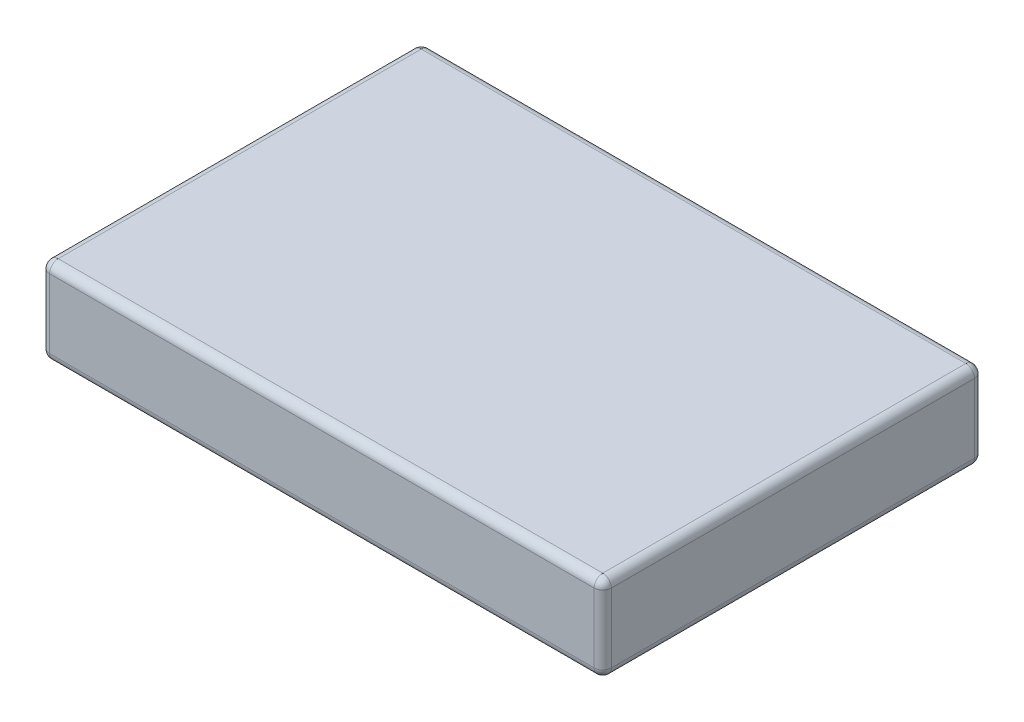
ISO-10303-21;
HEADER;
FILE_DESCRIPTION(('STEP AP214'),'2;1');
FILE_NAME('part.step','',(''),(''),'','','');
FILE_SCHEMA(('AUTOMOTIVE_DESIGN { 1 0 10303 214 1 1 1 1 }'));
ENDSEC;
DATA;
#1=APPLICATION_CONTEXT('core data for automotive mechanical design processes');
#2=APPLICATION_PROTOCOL_DEFINITION('international standard','automotive_design',2000,#1);
#3=PRODUCT_CONTEXT('',#1,'mechanical');
#4=PRODUCT('Part','Part','',(#3));
#5=PRODUCT_RELATED_PRODUCT_CATEGORY('part','',(#4));
#6=PRODUCT_DEFINITION_FORMATION('','',#4);
#7=PRODUCT_DEFINITION_CONTEXT('part definition',#1,'design');
#8=PRODUCT_DEFINITION('design','',#6,#7);
#9=PRODUCT_DEFINITION_SHAPE('','',#8);
#10=(LENGTH_UNIT() NAMED_UNIT(*) SI_UNIT(.MILLI.,.METRE.));
#11=(NAMED_UNIT(*) PLANE_ANGLE_UNIT() SI_UNIT($,.RADIAN.));
#12=(NAMED_UNIT(*) SI_UNIT($,.STERADIAN.) SOLID_ANGLE_UNIT());
#13=UNCERTAINTY_MEASURE_WITH_UNIT(LENGTH_MEASURE(1.E-05),#10,'distance_accuracy_value','');
#14=(GEOMETRIC_REPRESENTATION_CONTEXT(3) GLOBAL_UNCERTAINTY_ASSIGNED_CONTEXT((#13)) GLOBAL_UNIT_ASSIGNED_CONTEXT((#10,
#11,#12)) REPRESENTATION_CONTEXT('',''));
#15=CARTESIAN_POINT('',(0.,0.,0.));
#16=DIRECTION('',(0.,0.,1.));
#17=DIRECTION('',(1.,0.,0.));
#18=AXIS2_PLACEMENT_3D('',#15,#16,#17);
#19=CARTESIAN_POINT('',(3.97905,3.1756,1.202025));
#20=DIRECTION('',(1.,0.,0.));
#21=DIRECTION('',(0.,0.,-1.));
#22=AXIS2_PLACEMENT_3D('',#19,#20,#21);
#23=PLANE('',#22);
#24=DIRECTION('',(0.,0.,-1.));
#25=VECTOR('',#24,1.);
#26=CARTESIAN_POINT('',(3.97905,3.1556,1.202025));
#27=LINE('',#26,#25);
#28=CARTESIAN_POINT('',(3.97905,3.1556,1.182025));
#29=VERTEX_POINT('',#28);
#30=CARTESIAN_POINT('',(3.97905,3.1556,0.342024999999994));
#31=VERTEX_POINT('',#30);
#32=EDGE_CURVE('E11',#29,#31,#27,.T.);
#33=ORIENTED_EDGE('',*,*,#32,.T.);
#34=DIRECTION('',(0.,-1.,0.));
#35=VECTOR('',#34,1.);
#36=CARTESIAN_POINT('',(3.97905,3.1756,0.342024999999994));
#37=LINE('',#36,#35);
#38=CARTESIAN_POINT('',(3.97905,2.9956,0.342024999999994));
#39=VERTEX_POINT('',#38);
#40=EDGE_CURVE('E24',#31,#39,#37,.T.);
#41=ORIENTED_EDGE('',*,*,#40,.T.);
#42=DIRECTION('',(0.,0.,1.));
#43=VECTOR('',#42,1.);
#44=CARTESIAN_POINT('',(3.97905,2.9956,1.202025));
#45=LINE('',#44,#43);
#46=CARTESIAN_POINT('',(3.97905,2.9956,1.182025));
#47=VERTEX_POINT('',#46);
#48=EDGE_CURVE('E211',#39,#47,#45,.T.);
#49=ORIENTED_EDGE('',*,*,#48,.T.);
#50=DIRECTION('',(0.,1.,0.));
#51=VECTOR('',#50,1.);
#52=CARTESIAN_POINT('',(3.97905,3.1756,1.182025));
#53=LINE('',#52,#51);
#54=EDGE_CURVE('E209',#47,#29,#53,.T.);
#55=ORIENTED_EDGE('',*,*,#54,.T.);
#56=EDGE_LOOP('',(#33,#41,#49,#55));
#57=FACE_BOUND('',#56,.T.);
#58=ADVANCED_FACE('F17',(#57),#23,.F.);
#59=CARTESIAN_POINT('',(3.97905,3.1756,1.202025));
#60=DIRECTION('',(0.,0.,-1.));
#61=DIRECTION('',(-1.,0.,0.));
#62=AXIS2_PLACEMENT_3D('',#59,#60,#61);
#63=PLANE('',#62);
#64=DIRECTION('',(-1.,0.,0.));
#65=VECTOR('',#64,1.);
#66=CARTESIAN_POINT('',(3.97905,3.1556,1.202025));
#67=LINE('',#66,#65);
#68=CARTESIAN_POINT('',(5.25905,3.1556,1.202025));
#69=VERTEX_POINT('',#68);
#70=CARTESIAN_POINT('',(3.99905,3.1556,1.202025));
#71=VERTEX_POINT('',#70);
#72=EDGE_CURVE('E207',#69,#71,#67,.T.);
#73=ORIENTED_EDGE('',*,*,#72,.T.);
#74=DIRECTION('',(0.,-1.,0.));
#75=VECTOR('',#74,1.);
#76=CARTESIAN_POINT('',(3.99905,3.1756,1.202025));
#77=LINE('',#76,#75);
#78=CARTESIAN_POINT('',(3.99905,2.9956,1.202025));
#79=VERTEX_POINT('',#78);
#80=EDGE_CURVE('E205',#71,#79,#77,.T.);
#81=ORIENTED_EDGE('',*,*,#80,.T.);
#82=DIRECTION('',(1.,0.,0.));
#83=VECTOR('',#82,1.);
#84=CARTESIAN_POINT('',(5.27905,2.9956,1.202025));
#85=LINE('',#84,#83);
#86=CARTESIAN_POINT('',(5.25905,2.9956,1.202025));
#87=VERTEX_POINT('',#86);
#88=EDGE_CURVE('E203',#79,#87,#85,.T.);
#89=ORIENTED_EDGE('',*,*,#88,.T.);
#90=DIRECTION('',(0.,1.,0.));
#91=VECTOR('',#90,1.);
#92=CARTESIAN_POINT('',(5.25905,3.1756,1.202025));
#93=LINE('',#92,#91);
#94=EDGE_CURVE('E200',#87,#69,#93,.T.);
#95=ORIENTED_EDGE('',*,*,#94,.T.);
#96=EDGE_LOOP('',(#73,#81,#89,#95));
#97=FACE_BOUND('',#96,.T.);
#98=ADVANCED_FACE('F258',(#97),#63,.F.);
#99=CARTESIAN_POINT('',(5.27905,3.1756,1.202025));
#100=DIRECTION('',(-1.,0.,0.));
#101=DIRECTION('',(0.,0.,1.));
#102=AXIS2_PLACEMENT_3D('',#99,#100,#101);
#103=PLANE('',#102);
#104=DIRECTION('',(0.,1.,0.));
#105=VECTOR('',#104,1.);
#106=CARTESIAN_POINT('',(5.27905,3.1756,0.342024999999994));
#107=LINE('',#106,#105);
#108=CARTESIAN_POINT('',(5.27905,2.9956,0.342024999999995));
#109=VERTEX_POINT('',#108);
#110=CARTESIAN_POINT('',(5.27905,3.1556,0.342024999999995));
#111=VERTEX_POINT('',#110);
#112=EDGE_CURVE('E198',#109,#111,#107,.T.);
#113=ORIENTED_EDGE('',*,*,#112,.T.);
#114=DIRECTION('',(0.,0.,1.));
#115=VECTOR('',#114,1.);
#116=CARTESIAN_POINT('',(5.27905,3.1556,1.202025));
#117=LINE('',#116,#115);
#118=CARTESIAN_POINT('',(5.27905,3.1556,1.182025));
#119=VERTEX_POINT('',#118);
#120=EDGE_CURVE('E196',#111,#119,#117,.T.);
#121=ORIENTED_EDGE('',*,*,#120,.T.);
#122=DIRECTION('',(0.,-1.,0.));
#123=VECTOR('',#122,1.);
#124=CARTESIAN_POINT('',(5.27905,3.1756,1.182025));
#125=LINE('',#124,#123);
#126=CARTESIAN_POINT('',(5.27905,2.9956,1.182025));
#127=VERTEX_POINT('',#126);
#128=EDGE_CURVE('E194',#119,#127,#125,.T.);
#129=ORIENTED_EDGE('',*,*,#128,.T.);
#130=DIRECTION('',(0.,0.,-1.));
#131=VECTOR('',#130,1.);
#132=CARTESIAN_POINT('',(5.27905,2.9956,0.322024999999995));
#133=LINE('',#132,#131);
#134=EDGE_CURVE('E138',#127,#109,#133,.T.);
#135=ORIENTED_EDGE('',*,*,#134,.T.);
#136=EDGE_LOOP('',(#113,#121,#129,#135));
#137=FACE_BOUND('',#136,.T.);
#138=ADVANCED_FACE('F278',(#137),#103,.F.);
#139=CARTESIAN_POINT('',(3.97905,3.1756,0.322024999999995));
#140=DIRECTION('',(0.,0.,1.));
#141=DIRECTION('',(1.,0.,0.));
#142=AXIS2_PLACEMENT_3D('',#139,#140,#141);
#143=PLANE('',#142);
#144=DIRECTION('',(1.,0.,0.));
#145=VECTOR('',#144,1.);
#146=CARTESIAN_POINT('',(3.97905,3.1556,0.322024999999995));
#147=LINE('',#146,#145);
#148=CARTESIAN_POINT('',(3.99905,3.1556,0.322024999999995));
#149=VERTEX_POINT('',#148);
#150=CARTESIAN_POINT('',(5.25905,3.1556,0.322024999999995));
#151=VERTEX_POINT('',#150);
#152=EDGE_CURVE('E191',#149,#151,#147,.T.);
#153=ORIENTED_EDGE('',*,*,#152,.T.);
#154=DIRECTION('',(0.,-1.,0.));
#155=VECTOR('',#154,1.);
#156=CARTESIAN_POINT('',(5.25905,3.1756,0.322024999999995));
#157=LINE('',#156,#155);
#158=CARTESIAN_POINT('',(5.25905,2.9956,0.322024999999995));
#159=VERTEX_POINT('',#158);
#160=EDGE_CURVE('E189',#151,#159,#157,.T.);
#161=ORIENTED_EDGE('',*,*,#160,.T.);
#162=DIRECTION('',(-1.,0.,0.));
#163=VECTOR('',#162,1.);
#164=CARTESIAN_POINT('',(3.97905,2.9956,0.322024999999995));
#165=LINE('',#164,#163);
#166=CARTESIAN_POINT('',(3.99905,2.9956,0.322024999999995));
#167=VERTEX_POINT('',#166);
#168=EDGE_CURVE('E187',#159,#167,#165,.T.);
#169=ORIENTED_EDGE('',*,*,#168,.T.);
#170=DIRECTION('',(0.,1.,0.));
#171=VECTOR('',#170,1.);
#172=CARTESIAN_POINT('',(3.99905,3.1756,0.322024999999995));
#173=LINE('',#172,#171);
#174=EDGE_CURVE('E184',#167,#149,#173,.T.);
#175=ORIENTED_EDGE('',*,*,#174,.T.);
#176=EDGE_LOOP('',(#153,#161,#169,#175));
#177=FACE_BOUND('',#176,.T.);
#178=ADVANCED_FACE('F282',(#177),#143,.F.);
#179=CARTESIAN_POINT('',(5.22905,3.1756,0.762024999999995));
#180=DIRECTION('',(0.,-1.,0.));
#181=DIRECTION('',(0.,0.,-1.));
#182=AXIS2_PLACEMENT_3D('',#179,#180,#181);
#183=PLANE('',#182);
#184=DIRECTION('',(1.,0.,0.));
#185=VECTOR('',#184,1.);
#186=CARTESIAN_POINT('',(5.22905,3.1756,1.182025));
#187=LINE('',#186,#185);
#188=CARTESIAN_POINT('',(3.99905,3.1756,1.182025));
#189=VERTEX_POINT('',#188);
#190=CARTESIAN_POINT('',(5.25905,3.1756,1.182025));
#191=VERTEX_POINT('',#190);
#192=EDGE_CURVE('E182',#189,#191,#187,.T.);
#193=ORIENTED_EDGE('',*,*,#192,.T.);
#194=DIRECTION('',(0.,0.,-1.));
#195=VECTOR('',#194,1.);
#196=CARTESIAN_POINT('',(5.25905,3.1756,0.762024999999995));
#197=LINE('',#196,#195);
#198=CARTESIAN_POINT('',(5.25905,3.1756,0.342024999999995));
#199=VERTEX_POINT('',#198);
#200=EDGE_CURVE('E180',#191,#199,#197,.T.);
#201=ORIENTED_EDGE('',*,*,#200,.T.);
#202=DIRECTION('',(-1.,0.,0.));
#203=VECTOR('',#202,1.);
#204=CARTESIAN_POINT('',(5.22905,3.1756,0.342024999999995));
#205=LINE('',#204,#203);
#206=CARTESIAN_POINT('',(3.99905,3.1756,0.342024999999995));
#207=VERTEX_POINT('',#206);
#208=EDGE_CURVE('E178',#199,#207,#205,.T.);
#209=ORIENTED_EDGE('',*,*,#208,.T.);
#210=DIRECTION('',(0.,0.,1.));
#211=VECTOR('',#210,1.);
#212=CARTESIAN_POINT('',(3.99905,3.1756,0.762024999999995));
#213=LINE('',#212,#211);
#214=EDGE_CURVE('E175',#207,#189,#213,.T.);
#215=ORIENTED_EDGE('',*,*,#214,.T.);
#216=EDGE_LOOP('',(#193,#201,#209,#215));
#217=FACE_BOUND('',#216,.T.);
#218=ADVANCED_FACE('F288',(#217),#183,.F.);
#219=CARTESIAN_POINT('',(5.22905,2.9756,0.762024999999995));
#220=DIRECTION('',(0.,-1.,0.));
#221=DIRECTION('',(0.,0.,-1.));
#222=AXIS2_PLACEMENT_3D('',#219,#220,#221);
#223=PLANE('',#222);
#224=DIRECTION('',(0.,0.,-1.));
#225=VECTOR('',#224,1.);
#226=CARTESIAN_POINT('',(3.99905,2.9756,0.322024999999995));
#227=LINE('',#226,#225);
#228=CARTESIAN_POINT('',(3.99905,2.9756,1.182025));
#229=VERTEX_POINT('',#228);
#230=CARTESIAN_POINT('',(3.99905,2.9756,0.342024999999995));
#231=VERTEX_POINT('',#230);
#232=EDGE_CURVE('E173',#229,#231,#227,.T.);
#233=ORIENTED_EDGE('',*,*,#232,.T.);
#234=DIRECTION('',(1.,0.,0.));
#235=VECTOR('',#234,1.);
#236=CARTESIAN_POINT('',(5.27905,2.9756,0.342024999999995));
#237=LINE('',#236,#235);
#238=CARTESIAN_POINT('',(5.25905,2.9756,0.342024999999995));
#239=VERTEX_POINT('',#238);
#240=EDGE_CURVE('E108',#231,#239,#237,.T.);
#241=ORIENTED_EDGE('',*,*,#240,.T.);
#242=DIRECTION('',(0.,0.,1.));
#243=VECTOR('',#242,1.);
#244=CARTESIAN_POINT('',(5.25905,2.9756,1.202025));
#245=LINE('',#244,#243);
#246=CARTESIAN_POINT('',(5.25905,2.9756,1.182025));
#247=VERTEX_POINT('',#246);
#248=EDGE_CURVE('E102',#239,#247,#245,.T.);
#249=ORIENTED_EDGE('',*,*,#248,.T.);
#250=DIRECTION('',(-1.,0.,0.));
#251=VECTOR('',#250,1.);
#252=CARTESIAN_POINT('',(3.97905,2.9756,1.182025));
#253=LINE('',#252,#251);
#254=EDGE_CURVE('E105',#247,#229,#253,.T.);
#255=ORIENTED_EDGE('',*,*,#254,.T.);
#256=EDGE_LOOP('',(#233,#241,#249,#255));
#257=FACE_BOUND('',#256,.T.);
#258=ADVANCED_FACE('F104',(#257),#223,.T.);
#259=CARTESIAN_POINT('',(3.99905,2.9956,1.202025));
#260=DIRECTION('',(0.,0.,-1.));
#261=DIRECTION('',(-1.,0.,0.));
#262=AXIS2_PLACEMENT_3D('',#259,#260,#261);
#263=CYLINDRICAL_SURFACE('',#262,0.0200000000000001);
#264=CARTESIAN_POINT('',(3.99905,2.9956,1.182025));
#265=DIRECTION('',(0.,0.,1.));
#266=DIRECTION('',(1.,0.,0.));
#267=AXIS2_PLACEMENT_3D('',#264,#265,#266);
#268=CIRCLE('',#267,0.0200000000000001);
#269=EDGE_CURVE('E124',#47,#229,#268,.T.);
#270=ORIENTED_EDGE('',*,*,#269,.F.);
#271=ORIENTED_EDGE('',*,*,#48,.F.);
#272=CARTESIAN_POINT('',(3.99905,2.9956,0.342024999999995));
#273=DIRECTION('',(0.,0.,-1.));
#274=DIRECTION('',(-1.,0.,0.));
#275=AXIS2_PLACEMENT_3D('',#272,#273,#274);
#276=CIRCLE('',#275,0.0200000000000001);
#277=EDGE_CURVE('E168',#231,#39,#276,.T.);
#278=ORIENTED_EDGE('',*,*,#277,.F.);
#279=ORIENTED_EDGE('',*,*,#232,.F.);
#280=EDGE_LOOP('',(#270,#271,#278,#279));
#281=FACE_BOUND('',#280,.T.);
#282=ADVANCED_FACE('F219',(#281),#263,.T.);
#283=CARTESIAN_POINT('',(3.99905,2.9956,1.182025));
#284=DIRECTION('',(0.,1.,0.));
#285=DIRECTION('',(1.,0.,0.));
#286=AXIS2_PLACEMENT_3D('',#283,#284,#285);
#287=SPHERICAL_SURFACE('',#286,0.02);
#288=CARTESIAN_POINT('',(3.99905,2.9956,1.182025));
#289=DIRECTION('',(0.,1.,0.));
#290=DIRECTION('',(0.,0.,-1.));
#291=AXIS2_PLACEMENT_3D('',#288,#289,#290);
#292=CIRCLE('',#291,0.0200000000000001);
#293=EDGE_CURVE('E165',#47,#79,#292,.T.);
#294=ORIENTED_EDGE('',*,*,#293,.F.);
#295=ORIENTED_EDGE('',*,*,#269,.T.);
#296=CARTESIAN_POINT('',(3.99905,2.9956,1.182025));
#297=DIRECTION('',(1.,0.,0.));
#298=DIRECTION('',(0.,0.,1.));
#299=AXIS2_PLACEMENT_3D('',#296,#297,#298);
#300=CIRCLE('',#299,0.0200000000000001);
#301=EDGE_CURVE('E123',#79,#229,#300,.T.);
#302=ORIENTED_EDGE('',*,*,#301,.F.);
#303=EDGE_LOOP('',(#294,#295,#302));
#304=FACE_BOUND('',#303,.T.);
#305=ADVANCED_FACE('F264',(#304),#287,.T.);
#306=CARTESIAN_POINT('',(3.99905,2.9956,0.342024999999995));
#307=DIRECTION('',(0.,1.,0.));
#308=DIRECTION('',(1.,0.,0.));
#309=AXIS2_PLACEMENT_3D('',#306,#307,#308);
#310=SPHERICAL_SURFACE('',#309,0.02);
#311=CARTESIAN_POINT('',(3.99905,2.9956,0.342024999999995));
#312=DIRECTION('',(1.,0.,0.));
#313=DIRECTION('',(0.,0.,1.));
#314=AXIS2_PLACEMENT_3D('',#311,#312,#313);
#315=CIRCLE('',#314,0.02);
#316=EDGE_CURVE('E161',#231,#167,#315,.T.);
#317=ORIENTED_EDGE('',*,*,#316,.F.);
#318=ORIENTED_EDGE('',*,*,#277,.T.);
#319=CARTESIAN_POINT('',(3.99905,2.9956,0.342024999999995));
#320=DIRECTION('',(0.,1.,0.));
#321=DIRECTION('',(0.,0.,-1.));
#322=AXIS2_PLACEMENT_3D('',#319,#320,#321);
#323=CIRCLE('',#322,0.02);
#324=EDGE_CURVE('E132',#167,#39,#323,.T.);
#325=ORIENTED_EDGE('',*,*,#324,.F.);
#326=EDGE_LOOP('',(#317,#318,#325));
#327=FACE_BOUND('',#326,.T.);
#328=ADVANCED_FACE('F224',(#327),#310,.T.);
#329=CARTESIAN_POINT('',(3.97905,2.9956,1.182025));
#330=DIRECTION('',(-1.,0.,0.));
#331=DIRECTION('',(0.,0.,1.));
#332=AXIS2_PLACEMENT_3D('',#329,#330,#331);
#333=CYLINDRICAL_SURFACE('',#332,0.0200000000000001);
#334=ORIENTED_EDGE('',*,*,#301,.T.);
#335=ORIENTED_EDGE('',*,*,#254,.F.);
#336=CARTESIAN_POINT('',(5.25905,2.9956,1.182025));
#337=DIRECTION('',(1.,0.,0.));
#338=DIRECTION('',(0.,0.,-1.));
#339=AXIS2_PLACEMENT_3D('',#336,#337,#338);
#340=CIRCLE('',#339,0.0200000000000001);
#341=EDGE_CURVE('E120',#87,#247,#340,.T.);
#342=ORIENTED_EDGE('',*,*,#341,.F.);
#343=ORIENTED_EDGE('',*,*,#88,.F.);
#344=EDGE_LOOP('',(#334,#335,#342,#343));
#345=FACE_BOUND('',#344,.T.);
#346=ADVANCED_FACE('F118',(#345),#333,.T.);
#347=CARTESIAN_POINT('',(3.99905,3.1756,1.182025));
#348=DIRECTION('',(0.,-1.,0.));
#349=DIRECTION('',(0.,0.,-1.));
#350=AXIS2_PLACEMENT_3D('',#347,#348,#349);
#351=CYLINDRICAL_SURFACE('',#350,0.0200000000000001);
#352=ORIENTED_EDGE('',*,*,#293,.T.);
#353=ORIENTED_EDGE('',*,*,#80,.F.);
#354=CARTESIAN_POINT('',(3.99905,3.1556,1.182025));
#355=DIRECTION('',(0.,1.,0.));
#356=DIRECTION('',(0.,0.,1.));
#357=AXIS2_PLACEMENT_3D('',#354,#355,#356);
#358=CIRCLE('',#357,0.0200000000000001);
#359=EDGE_CURVE('E133',#29,#71,#358,.T.);
#360=ORIENTED_EDGE('',*,*,#359,.F.);
#361=ORIENTED_EDGE('',*,*,#54,.F.);
#362=EDGE_LOOP('',(#352,#353,#360,#361));
#363=FACE_BOUND('',#362,.T.);
#364=ADVANCED_FACE('F261',(#363),#351,.T.);
#365=CARTESIAN_POINT('',(3.99905,3.1556,0.762024999999995));
#366=DIRECTION('',(0.,0.,1.));
#367=DIRECTION('',(1.,0.,0.));
#368=AXIS2_PLACEMENT_3D('',#365,#366,#367);
#369=CYLINDRICAL_SURFACE('',#368,0.0200000000000001);
#370=CARTESIAN_POINT('',(3.99905,3.1556,0.342024999999995));
#371=DIRECTION('',(0.,0.,-1.));
#372=DIRECTION('',(0.,1.,0.));
#373=AXIS2_PLACEMENT_3D('',#370,#371,#372);
#374=CIRCLE('',#373,0.0200000000000001);
#375=EDGE_CURVE('E154',#31,#207,#374,.T.);
#376=ORIENTED_EDGE('',*,*,#375,.F.);
#377=ORIENTED_EDGE('',*,*,#32,.F.);
#378=CARTESIAN_POINT('',(3.99905,3.1556,1.182025));
#379=DIRECTION('',(0.,0.,1.));
#380=DIRECTION('',(1.,0.,0.));
#381=AXIS2_PLACEMENT_3D('',#378,#379,#380);
#382=CIRCLE('',#381,0.0200000000000001);
#383=EDGE_CURVE('E151',#189,#29,#382,.T.);
#384=ORIENTED_EDGE('',*,*,#383,.F.);
#385=ORIENTED_EDGE('',*,*,#214,.F.);
#386=EDGE_LOOP('',(#376,#377,#384,#385));
#387=FACE_BOUND('',#386,.T.);
#388=ADVANCED_FACE('F336',(#387),#369,.T.);
#389=CARTESIAN_POINT('',(3.99905,3.1756,0.342024999999995));
#390=DIRECTION('',(0.,-1.,0.));
#391=DIRECTION('',(0.,0.,-1.));
#392=AXIS2_PLACEMENT_3D('',#389,#390,#391);
#393=CYLINDRICAL_SURFACE('',#392,0.02);
#394=ORIENTED_EDGE('',*,*,#324,.T.);
#395=ORIENTED_EDGE('',*,*,#40,.F.);
#396=CARTESIAN_POINT('',(3.99905,3.1556,0.342024999999995));
#397=DIRECTION('',(0.,1.,0.));
#398=DIRECTION('',(0.,0.,1.));
#399=AXIS2_PLACEMENT_3D('',#396,#397,#398);
#400=CIRCLE('',#399,0.02);
#401=EDGE_CURVE('E143',#149,#31,#400,.T.);
#402=ORIENTED_EDGE('',*,*,#401,.F.);
#403=ORIENTED_EDGE('',*,*,#174,.F.);
#404=EDGE_LOOP('',(#394,#395,#402,#403));
#405=FACE_BOUND('',#404,.T.);
#406=ADVANCED_FACE('F226',(#405),#393,.T.);
#407=CARTESIAN_POINT('',(3.97905,2.9956,0.342024999999995));
#408=DIRECTION('',(1.,0.,0.));
#409=DIRECTION('',(0.,0.,-1.));
#410=AXIS2_PLACEMENT_3D('',#407,#408,#409);
#411=CYLINDRICAL_SURFACE('',#410,0.02);
#412=ORIENTED_EDGE('',*,*,#316,.T.);
#413=ORIENTED_EDGE('',*,*,#168,.F.);
#414=CARTESIAN_POINT('',(5.25905,2.9956,0.342024999999995));
#415=DIRECTION('',(1.,0.,0.));
#416=DIRECTION('',(0.,0.,-1.));
#417=AXIS2_PLACEMENT_3D('',#414,#415,#416);
#418=CIRCLE('',#417,0.02);
#419=EDGE_CURVE('E139',#239,#159,#418,.T.);
#420=ORIENTED_EDGE('',*,*,#419,.F.);
#421=ORIENTED_EDGE('',*,*,#240,.F.);
#422=EDGE_LOOP('',(#412,#413,#420,#421));
#423=FACE_BOUND('',#422,.T.);
#424=ADVANCED_FACE('F231',(#423),#411,.T.);
#425=CARTESIAN_POINT('',(5.25905,2.9956,1.202025));
#426=DIRECTION('',(0.,0.,1.));
#427=DIRECTION('',(1.,0.,0.));
#428=AXIS2_PLACEMENT_3D('',#425,#426,#427);
#429=CYLINDRICAL_SURFACE('',#428,0.0200000000000001);
#430=CARTESIAN_POINT('',(5.25905,2.9956,1.182025));
#431=DIRECTION('',(0.,0.,1.));
#432=DIRECTION('',(1.,0.,0.));
#433=AXIS2_PLACEMENT_3D('',#430,#431,#432);
#434=CIRCLE('',#433,0.0200000000000001);
#435=EDGE_CURVE('E129',#247,#127,#434,.T.);
#436=ORIENTED_EDGE('',*,*,#435,.F.);
#437=ORIENTED_EDGE('',*,*,#248,.F.);
#438=CARTESIAN_POINT('',(5.25905,2.9956,0.342024999999995));
#439=DIRECTION('',(0.,0.,-1.));
#440=DIRECTION('',(-1.,0.,0.));
#441=AXIS2_PLACEMENT_3D('',#438,#439,#440);
#442=CIRCLE('',#441,0.0200000000000001);
#443=EDGE_CURVE('E140',#109,#239,#442,.T.);
#444=ORIENTED_EDGE('',*,*,#443,.F.);
#445=ORIENTED_EDGE('',*,*,#134,.F.);
#446=EDGE_LOOP('',(#436,#437,#444,#445));
#447=FACE_BOUND('',#446,.T.);
#448=ADVANCED_FACE('F136',(#447),#429,.T.);
#449=CARTESIAN_POINT('',(5.25905,2.9956,1.182025));
#450=DIRECTION('',(0.,1.,0.));
#451=DIRECTION('',(1.,0.,0.));
#452=AXIS2_PLACEMENT_3D('',#449,#450,#451);
#453=SPHERICAL_SURFACE('',#452,0.02);
#454=ORIENTED_EDGE('',*,*,#341,.T.);
#455=ORIENTED_EDGE('',*,*,#435,.T.);
#456=CARTESIAN_POINT('',(5.25905,2.9956,1.182025));
#457=DIRECTION('',(0.,1.,0.));
#458=DIRECTION('',(0.,0.,-1.));
#459=AXIS2_PLACEMENT_3D('',#456,#457,#458);
#460=CIRCLE('',#459,0.0200000000000001);
#461=EDGE_CURVE('E131',#87,#127,#460,.T.);
#462=ORIENTED_EDGE('',*,*,#461,.F.);
#463=EDGE_LOOP('',(#454,#455,#462));
#464=FACE_BOUND('',#463,.T.);
#465=ADVANCED_FACE('F128',(#464),#453,.T.);
#466=CARTESIAN_POINT('',(3.99905,3.1556,1.182025));
#467=DIRECTION('',(0.,1.,0.));
#468=DIRECTION('',(1.,0.,0.));
#469=AXIS2_PLACEMENT_3D('',#466,#467,#468);
#470=SPHERICAL_SURFACE('',#469,0.02);
#471=ORIENTED_EDGE('',*,*,#383,.T.);
#472=ORIENTED_EDGE('',*,*,#359,.T.);
#473=CARTESIAN_POINT('',(3.99905,3.1556,1.182025));
#474=DIRECTION('',(1.,0.,0.));
#475=DIRECTION('',(0.,0.,1.));
#476=AXIS2_PLACEMENT_3D('',#473,#474,#475);
#477=CIRCLE('',#476,0.0200000000000001);
#478=EDGE_CURVE('E243',#189,#71,#477,.T.);
#479=ORIENTED_EDGE('',*,*,#478,.F.);
#480=EDGE_LOOP('',(#471,#472,#479));
#481=FACE_BOUND('',#480,.T.);
#482=ADVANCED_FACE('F377',(#481),#470,.T.);
#483=CARTESIAN_POINT('',(3.99905,3.1556,0.342024999999995));
#484=DIRECTION('',(0.,1.,0.));
#485=DIRECTION('',(1.,0.,0.));
#486=AXIS2_PLACEMENT_3D('',#483,#484,#485);
#487=SPHERICAL_SURFACE('',#486,0.02);
#488=ORIENTED_EDGE('',*,*,#401,.T.);
#489=ORIENTED_EDGE('',*,*,#375,.T.);
#490=CARTESIAN_POINT('',(3.99905,3.1556,0.342024999999995));
#491=DIRECTION('',(1.,0.,0.));
#492=DIRECTION('',(0.,0.,1.));
#493=AXIS2_PLACEMENT_3D('',#490,#491,#492);
#494=CIRCLE('',#493,0.02);
#495=EDGE_CURVE('E239',#149,#207,#494,.T.);
#496=ORIENTED_EDGE('',*,*,#495,.F.);
#497=EDGE_LOOP('',(#488,#489,#496));
#498=FACE_BOUND('',#497,.T.);
#499=ADVANCED_FACE('F386',(#498),#487,.T.);
#500=CARTESIAN_POINT('',(5.25905,2.9956,0.342024999999995));
#501=DIRECTION('',(0.,1.,0.));
#502=DIRECTION('',(1.,0.,0.));
#503=AXIS2_PLACEMENT_3D('',#500,#501,#502);
#504=SPHERICAL_SURFACE('',#503,0.02);
#505=ORIENTED_EDGE('',*,*,#443,.T.);
#506=ORIENTED_EDGE('',*,*,#419,.T.);
#507=CARTESIAN_POINT('',(5.25905,2.9956,0.342024999999995));
#508=DIRECTION('',(0.,1.,0.));
#509=DIRECTION('',(0.,0.,-1.));
#510=AXIS2_PLACEMENT_3D('',#507,#508,#509);
#511=CIRCLE('',#510,0.02);
#512=EDGE_CURVE('E236',#109,#159,#511,.T.);
#513=ORIENTED_EDGE('',*,*,#512,.F.);
#514=EDGE_LOOP('',(#505,#506,#513));
#515=FACE_BOUND('',#514,.T.);
#516=ADVANCED_FACE('F235',(#515),#504,.T.);
#517=CARTESIAN_POINT('',(5.25905,3.1756,1.182025));
#518=DIRECTION('',(0.,-1.,0.));
#519=DIRECTION('',(0.,0.,-1.));
#520=AXIS2_PLACEMENT_3D('',#517,#518,#519);
#521=CYLINDRICAL_SURFACE('',#520,0.0200000000000001);
#522=ORIENTED_EDGE('',*,*,#461,.T.);
#523=ORIENTED_EDGE('',*,*,#128,.F.);
#524=CARTESIAN_POINT('',(5.25905,3.1556,1.182025));
#525=DIRECTION('',(0.,1.,0.));
#526=DIRECTION('',(0.,0.,1.));
#527=AXIS2_PLACEMENT_3D('',#524,#525,#526);
#528=CIRCLE('',#527,0.0200000000000001);
#529=EDGE_CURVE('E240',#69,#119,#528,.T.);
#530=ORIENTED_EDGE('',*,*,#529,.F.);
#531=ORIENTED_EDGE('',*,*,#94,.F.);
#532=EDGE_LOOP('',(#522,#523,#530,#531));
#533=FACE_BOUND('',#532,.T.);
#534=ADVANCED_FACE('F254',(#533),#521,.T.);
#535=CARTESIAN_POINT('',(5.22905,3.1556,1.182025));
#536=DIRECTION('',(1.,0.,0.));
#537=DIRECTION('',(0.,0.,-1.));
#538=AXIS2_PLACEMENT_3D('',#535,#536,#537);
#539=CYLINDRICAL_SURFACE('',#538,0.0200000000000001);
#540=ORIENTED_EDGE('',*,*,#478,.T.);
#541=ORIENTED_EDGE('',*,*,#72,.F.);
#542=CARTESIAN_POINT('',(5.25905,3.1556,1.182025));
#543=DIRECTION('',(1.,0.,0.));
#544=DIRECTION('',(0.,0.,-1.));
#545=AXIS2_PLACEMENT_3D('',#542,#543,#544);
#546=CIRCLE('',#545,0.0200000000000001);
#547=EDGE_CURVE('E246',#191,#69,#546,.T.);
#548=ORIENTED_EDGE('',*,*,#547,.F.);
#549=ORIENTED_EDGE('',*,*,#192,.F.);
#550=EDGE_LOOP('',(#540,#541,#548,#549));
#551=FACE_BOUND('',#550,.T.);
#552=ADVANCED_FACE('F413',(#551),#539,.T.);
#553=CARTESIAN_POINT('',(5.22905,3.1556,0.342024999999995));
#554=DIRECTION('',(-1.,0.,0.));
#555=DIRECTION('',(0.,0.,1.));
#556=AXIS2_PLACEMENT_3D('',#553,#554,#555);
#557=CYLINDRICAL_SURFACE('',#556,0.02);
#558=ORIENTED_EDGE('',*,*,#495,.T.);
#559=ORIENTED_EDGE('',*,*,#208,.F.);
#560=CARTESIAN_POINT('',(5.25905,3.1556,0.342024999999995));
#561=DIRECTION('',(1.,0.,0.));
#562=DIRECTION('',(0.,1.,0.));
#563=AXIS2_PLACEMENT_3D('',#560,#561,#562);
#564=CIRCLE('',#563,0.0200000000000001);
#565=EDGE_CURVE('E487',#151,#199,#564,.T.);
#566=ORIENTED_EDGE('',*,*,#565,.F.);
#567=ORIENTED_EDGE('',*,*,#152,.F.);
#568=EDGE_LOOP('',(#558,#559,#566,#567));
#569=FACE_BOUND('',#568,.T.);
#570=ADVANCED_FACE('F422',(#569),#557,.T.);
#571=CARTESIAN_POINT('',(5.25905,3.1756,0.342024999999995));
#572=DIRECTION('',(0.,-1.,0.));
#573=DIRECTION('',(0.,0.,-1.));
#574=AXIS2_PLACEMENT_3D('',#571,#572,#573);
#575=CYLINDRICAL_SURFACE('',#574,0.02);
#576=ORIENTED_EDGE('',*,*,#512,.T.);
#577=ORIENTED_EDGE('',*,*,#160,.F.);
#578=CARTESIAN_POINT('',(5.25905,3.1556,0.342024999999995));
#579=DIRECTION('',(0.,1.,0.));
#580=DIRECTION('',(0.,0.,1.));
#581=AXIS2_PLACEMENT_3D('',#578,#579,#580);
#582=CIRCLE('',#581,0.02);
#583=EDGE_CURVE('E483',#111,#151,#582,.T.);
#584=ORIENTED_EDGE('',*,*,#583,.F.);
#585=ORIENTED_EDGE('',*,*,#112,.F.);
#586=EDGE_LOOP('',(#576,#577,#584,#585));
#587=FACE_BOUND('',#586,.T.);
#588=ADVANCED_FACE('F432',(#587),#575,.T.);
#589=CARTESIAN_POINT('',(5.25905,3.1556,1.182025));
#590=DIRECTION('',(0.,1.,0.));
#591=DIRECTION('',(1.,0.,0.));
#592=AXIS2_PLACEMENT_3D('',#589,#590,#591);
#593=SPHERICAL_SURFACE('',#592,0.02);
#594=ORIENTED_EDGE('',*,*,#547,.T.);
#595=ORIENTED_EDGE('',*,*,#529,.T.);
#596=CARTESIAN_POINT('',(5.25905,3.1556,1.182025));
#597=DIRECTION('',(0.,0.,-1.));
#598=DIRECTION('',(1.,0.,0.));
#599=AXIS2_PLACEMENT_3D('',#596,#597,#598);
#600=CIRCLE('',#599,0.0200000000000001);
#601=EDGE_CURVE('E479',#191,#119,#600,.T.);
#602=ORIENTED_EDGE('',*,*,#601,.F.);
#603=EDGE_LOOP('',(#594,#595,#602));
#604=FACE_BOUND('',#603,.T.);
#605=ADVANCED_FACE('F442',(#604),#593,.T.);
#606=CARTESIAN_POINT('',(5.25905,3.1556,0.342024999999995));
#607=DIRECTION('',(0.,1.,0.));
#608=DIRECTION('',(1.,0.,0.));
#609=AXIS2_PLACEMENT_3D('',#606,#607,#608);
#610=SPHERICAL_SURFACE('',#609,0.02);
#611=ORIENTED_EDGE('',*,*,#583,.T.);
#612=ORIENTED_EDGE('',*,*,#565,.T.);
#613=CARTESIAN_POINT('',(5.25905,3.1556,0.342024999999995));
#614=DIRECTION('',(0.,0.,1.));
#615=DIRECTION('',(-1.,0.,0.));
#616=AXIS2_PLACEMENT_3D('',#613,#614,#615);
#617=CIRCLE('',#616,0.0200000000000001);
#618=EDGE_CURVE('E484',#111,#199,#617,.T.);
#619=ORIENTED_EDGE('',*,*,#618,.F.);
#620=EDGE_LOOP('',(#611,#612,#619));
#621=FACE_BOUND('',#620,.T.);
#622=ADVANCED_FACE('F451',(#621),#610,.T.);
#623=CARTESIAN_POINT('',(5.25905,3.1556,0.762024999999995));
#624=DIRECTION('',(0.,0.,-1.));
#625=DIRECTION('',(-1.,0.,0.));
#626=AXIS2_PLACEMENT_3D('',#623,#624,#625);
#627=CYLINDRICAL_SURFACE('',#626,0.0200000000000001);
#628=ORIENTED_EDGE('',*,*,#601,.T.);
#629=ORIENTED_EDGE('',*,*,#120,.F.);
#630=ORIENTED_EDGE('',*,*,#618,.T.);
#631=ORIENTED_EDGE('',*,*,#200,.F.);
#632=EDGE_LOOP('',(#628,#629,#630,#631));
#633=FACE_BOUND('',#632,.T.);
#634=ADVANCED_FACE('F461',(#633),#627,.T.);
#635=CLOSED_SHELL('',(#58,#98,#138,#178,#218,#258,#282,#305,#328,#346,#364,#388,#406,#424,#448,
#465,#482,#499,#516,#534,#552,#570,#588,#605,#622,#634));
#636=MANIFOLD_SOLID_BREP('B1',#635);
#637=ADVANCED_BREP_SHAPE_REPRESENTATION('',(#18,#636),#14);
#638=SHAPE_DEFINITION_REPRESENTATION(#9,#637);
ENDSEC;
END-ISO-10303-21;
